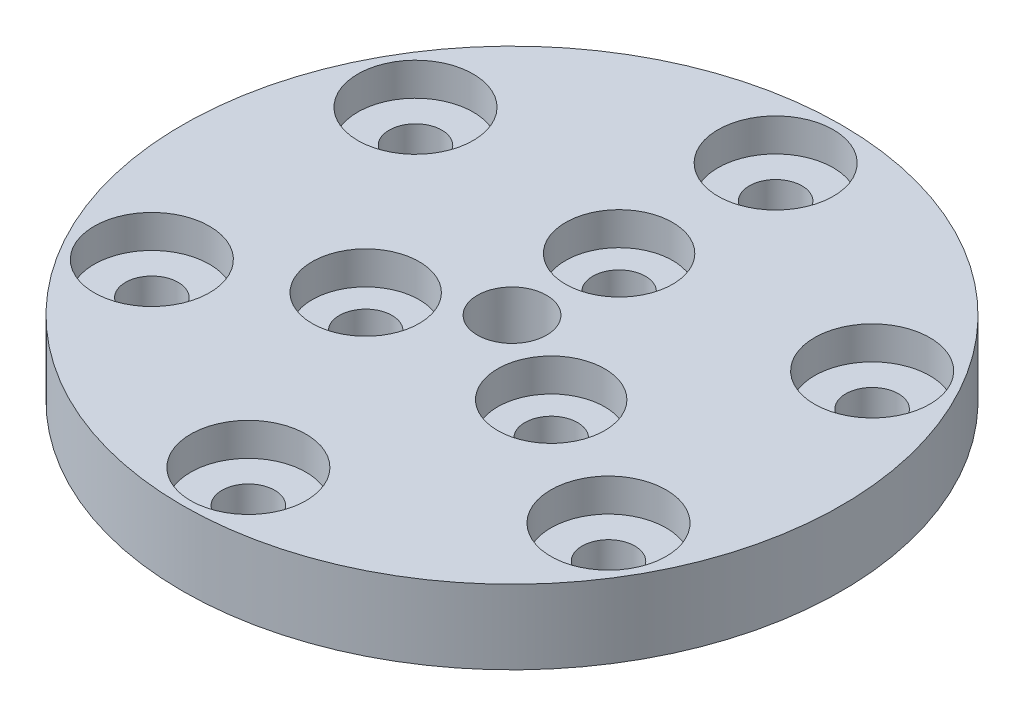
ISO-10303-21;
HEADER;
FILE_DESCRIPTION(('STEP AP214'),'2;1');
FILE_NAME('part.step','',(''),(''),'','','');
FILE_SCHEMA(('AUTOMOTIVE_DESIGN { 1 0 10303 214 1 1 1 1 }'));
ENDSEC;
DATA;
#1=APPLICATION_CONTEXT('core data for automotive mechanical design processes');
#2=APPLICATION_PROTOCOL_DEFINITION('international standard','automotive_design',2000,#1);
#3=PRODUCT_CONTEXT('',#1,'mechanical');
#4=PRODUCT('Part','Part','',(#3));
#5=PRODUCT_RELATED_PRODUCT_CATEGORY('part','',(#4));
#6=PRODUCT_DEFINITION_FORMATION('','',#4);
#7=PRODUCT_DEFINITION_CONTEXT('part definition',#1,'design');
#8=PRODUCT_DEFINITION('design','',#6,#7);
#9=PRODUCT_DEFINITION_SHAPE('','',#8);
#10=(LENGTH_UNIT() NAMED_UNIT(*) SI_UNIT(.MILLI.,.METRE.));
#11=(NAMED_UNIT(*) PLANE_ANGLE_UNIT() SI_UNIT($,.RADIAN.));
#12=(NAMED_UNIT(*) SI_UNIT($,.STERADIAN.) SOLID_ANGLE_UNIT());
#13=UNCERTAINTY_MEASURE_WITH_UNIT(LENGTH_MEASURE(1.E-05),#10,'distance_accuracy_value','');
#14=(GEOMETRIC_REPRESENTATION_CONTEXT(3) GLOBAL_UNCERTAINTY_ASSIGNED_CONTEXT((#13)) GLOBAL_UNIT_ASSIGNED_CONTEXT((#10,
#11,#12)) REPRESENTATION_CONTEXT('',''));
#15=CARTESIAN_POINT('',(0.,0.,0.));
#16=DIRECTION('',(0.,0.,1.));
#17=DIRECTION('',(1.,0.,0.));
#18=AXIS2_PLACEMENT_3D('',#15,#16,#17);
#19=CARTESIAN_POINT('',(-5.6291651245989,0.,3.24999999999996));
#20=DIRECTION('',(0.,1.,0.));
#21=DIRECTION('',(-1.,0.,0.));
#22=AXIS2_PLACEMENT_3D('',#19,#20,#21);
#23=CYLINDRICAL_SURFACE('',#22,1.6);
#24=CARTESIAN_POINT('',(-5.6291651245989,0.,3.24999999999996));
#25=DIRECTION('',(0.,1.,0.));
#26=DIRECTION('',(0.866025403784443,0.,-0.499999999999992));
#27=AXIS2_PLACEMENT_3D('',#24,#25,#26);
#28=CIRCLE('',#27,1.6);
#29=CARTESIAN_POINT('',(-4.24352447854379,0.,2.44999999999997));
#30=VERTEX_POINT('',#29);
#31=EDGE_CURVE('E85',#30,#30,#28,.T.);
#32=ORIENTED_EDGE('',*,*,#31,.F.);
#33=EDGE_LOOP('',(#32));
#34=FACE_BOUND('',#33,.T.);
#35=CARTESIAN_POINT('',(-5.6291651245989,2.50000000000155,3.24999999999996));
#36=DIRECTION('',(0.,1.,0.));
#37=DIRECTION('',(-1.,0.,0.));
#38=AXIS2_PLACEMENT_3D('',#35,#36,#37);
#39=CIRCLE('',#38,1.6);
#40=CARTESIAN_POINT('',(-7.2291651245989,2.50000000000155,3.24999999999996));
#41=VERTEX_POINT('',#40);
#42=EDGE_CURVE('E39',#41,#41,#39,.F.);
#43=ORIENTED_EDGE('',*,*,#42,.F.);
#44=EDGE_LOOP('',(#43));
#45=FACE_BOUND('',#44,.T.);
#46=ADVANCED_FACE('F35',(#34,#45),#23,.F.);
#47=CARTESIAN_POINT('',(5.62916512459886,0.,3.25000000000004));
#48=DIRECTION('',(0.,1.,0.));
#49=DIRECTION('',(-1.,0.,0.));
#50=AXIS2_PLACEMENT_3D('',#47,#48,#49);
#51=CYLINDRICAL_SURFACE('',#50,1.6);
#52=CARTESIAN_POINT('',(5.62916512459886,0.,3.25000000000004));
#53=DIRECTION('',(0.,1.,0.));
#54=DIRECTION('',(-0.866025403784436,0.,-0.500000000000004));
#55=AXIS2_PLACEMENT_3D('',#52,#53,#54);
#56=CIRCLE('',#55,1.6);
#57=CARTESIAN_POINT('',(4.24352447854376,0.,2.45000000000003));
#58=VERTEX_POINT('',#57);
#59=EDGE_CURVE('E100',#58,#58,#56,.T.);
#60=ORIENTED_EDGE('',*,*,#59,.F.);
#61=EDGE_LOOP('',(#60));
#62=FACE_BOUND('',#61,.T.);
#63=CARTESIAN_POINT('',(5.62916512459886,2.50000000000155,3.25000000000004));
#64=DIRECTION('',(0.,1.,0.));
#65=DIRECTION('',(-1.,0.,0.));
#66=AXIS2_PLACEMENT_3D('',#63,#64,#65);
#67=CIRCLE('',#66,1.6);
#68=CARTESIAN_POINT('',(4.02916512459886,2.50000000000155,3.25000000000004));
#69=VERTEX_POINT('',#68);
#70=EDGE_CURVE('E79',#69,#69,#67,.F.);
#71=ORIENTED_EDGE('',*,*,#70,.F.);
#72=EDGE_LOOP('',(#71));
#73=FACE_BOUND('',#72,.T.);
#74=ADVANCED_FACE('F186',(#62,#73),#51,.F.);
#75=CARTESIAN_POINT('',(0.,0.,-6.50000000000002));
#76=DIRECTION('',(0.,1.,0.));
#77=DIRECTION('',(0.,0.,1.));
#78=AXIS2_PLACEMENT_3D('',#75,#76,#77);
#79=CYLINDRICAL_SURFACE('',#78,1.6);
#80=CARTESIAN_POINT('',(0.,0.,-6.50000000000002));
#81=DIRECTION('',(0.,1.,0.));
#82=DIRECTION('',(0.,0.,1.));
#83=AXIS2_PLACEMENT_3D('',#80,#81,#82);
#84=CIRCLE('',#83,1.6);
#85=CARTESIAN_POINT('',(0.,0.,-4.90000000000002));
#86=VERTEX_POINT('',#85);
#87=EDGE_CURVE('E77',#86,#86,#84,.T.);
#88=ORIENTED_EDGE('',*,*,#87,.F.);
#89=EDGE_LOOP('',(#88));
#90=FACE_BOUND('',#89,.T.);
#91=CARTESIAN_POINT('',(0.,2.50000000000155,-6.50000000000002));
#92=DIRECTION('',(0.,1.,0.));
#93=DIRECTION('',(0.,0.,1.));
#94=AXIS2_PLACEMENT_3D('',#91,#92,#93);
#95=CIRCLE('',#94,1.6);
#96=CARTESIAN_POINT('',(0.,2.50000000000155,-4.90000000000002));
#97=VERTEX_POINT('',#96);
#98=EDGE_CURVE('E75',#97,#97,#95,.F.);
#99=ORIENTED_EDGE('',*,*,#98,.F.);
#100=EDGE_LOOP('',(#99));
#101=FACE_BOUND('',#100,.T.);
#102=ADVANCED_FACE('F192',(#90,#101),#79,.F.);
#103=CARTESIAN_POINT('',(-13.856406460551,4.50000000000154,7.99999999999997));
#104=DIRECTION('',(0.,-1.,0.));
#105=DIRECTION('',(0.,0.,-1.));
#106=AXIS2_PLACEMENT_3D('',#103,#104,#105);
#107=CYLINDRICAL_SURFACE('',#106,1.6);
#108=CARTESIAN_POINT('',(-13.856406460551,0.,7.99999999999997));
#109=DIRECTION('',(0.,-1.,0.));
#110=DIRECTION('',(0.86602540378444,0.,-0.499999999999998));
#111=AXIS2_PLACEMENT_3D('',#108,#109,#110);
#112=CIRCLE('',#111,1.6);
#113=CARTESIAN_POINT('',(-12.4707658144959,0.,7.19999999999997));
#114=VERTEX_POINT('',#113);
#115=EDGE_CURVE('E144',#114,#114,#112,.T.);
#116=ORIENTED_EDGE('',*,*,#115,.T.);
#117=EDGE_LOOP('',(#116));
#118=FACE_BOUND('',#117,.T.);
#119=CARTESIAN_POINT('',(-13.856406460551,2.50000000000153,7.99999999999997));
#120=DIRECTION('',(0.,1.,0.));
#121=DIRECTION('',(-1.,0.,0.));
#122=AXIS2_PLACEMENT_3D('',#119,#120,#121);
#123=CIRCLE('',#122,1.6);
#124=CARTESIAN_POINT('',(-15.456406460551,2.50000000000153,7.99999999999997));
#125=VERTEX_POINT('',#124);
#126=EDGE_CURVE('E71',#125,#125,#123,.F.);
#127=ORIENTED_EDGE('',*,*,#126,.F.);
#128=EDGE_LOOP('',(#127));
#129=FACE_BOUND('',#128,.T.);
#130=ADVANCED_FACE('F211',(#118,#129),#107,.F.);
#131=CARTESIAN_POINT('',(-13.856406460551,4.50000000000154,-8.00000000000007));
#132=DIRECTION('',(0.,-1.,0.));
#133=DIRECTION('',(0.,0.,-1.));
#134=AXIS2_PLACEMENT_3D('',#131,#132,#133);
#135=CYLINDRICAL_SURFACE('',#134,1.6);
#136=CARTESIAN_POINT('',(-13.856406460551,0.,-8.00000000000007));
#137=DIRECTION('',(0.,-1.,0.));
#138=DIRECTION('',(0.866025403784436,0.,0.500000000000004));
#139=AXIS2_PLACEMENT_3D('',#136,#137,#138);
#140=CIRCLE('',#139,1.6);
#141=CARTESIAN_POINT('',(-12.4707658144959,0.,-7.20000000000006));
#142=VERTEX_POINT('',#141);
#143=EDGE_CURVE('E141',#142,#142,#140,.T.);
#144=ORIENTED_EDGE('',*,*,#143,.T.);
#145=EDGE_LOOP('',(#144));
#146=FACE_BOUND('',#145,.T.);
#147=CARTESIAN_POINT('',(-13.856406460551,2.50000000000153,-8.00000000000007));
#148=DIRECTION('',(0.,1.,0.));
#149=DIRECTION('',(-1.,0.,0.));
#150=AXIS2_PLACEMENT_3D('',#147,#148,#149);
#151=CIRCLE('',#150,1.6);
#152=CARTESIAN_POINT('',(-15.456406460551,2.50000000000153,-8.00000000000007));
#153=VERTEX_POINT('',#152);
#154=EDGE_CURVE('E68',#153,#153,#151,.F.);
#155=ORIENTED_EDGE('',*,*,#154,.F.);
#156=EDGE_LOOP('',(#155));
#157=FACE_BOUND('',#156,.T.);
#158=ADVANCED_FACE('F252',(#146,#157),#135,.F.);
#159=CARTESIAN_POINT('',(0.,4.50000000000154,-16.));
#160=DIRECTION('',(0.,-1.,0.));
#161=DIRECTION('',(0.,0.,-1.));
#162=AXIS2_PLACEMENT_3D('',#159,#160,#161);
#163=CYLINDRICAL_SURFACE('',#162,1.6);
#164=CARTESIAN_POINT('',(0.,0.,-16.));
#165=DIRECTION('',(0.,-1.,0.));
#166=DIRECTION('',(0.,0.,1.));
#167=AXIS2_PLACEMENT_3D('',#164,#165,#166);
#168=CIRCLE('',#167,1.6);
#169=CARTESIAN_POINT('',(0.,0.,-14.4));
#170=VERTEX_POINT('',#169);
#171=EDGE_CURVE('E145',#170,#170,#168,.T.);
#172=ORIENTED_EDGE('',*,*,#171,.T.);
#173=EDGE_LOOP('',(#172));
#174=FACE_BOUND('',#173,.T.);
#175=CARTESIAN_POINT('',(0.,2.50000000000153,-16.));
#176=DIRECTION('',(0.,1.,0.));
#177=DIRECTION('',(0.,0.,1.));
#178=AXIS2_PLACEMENT_3D('',#175,#176,#177);
#179=CIRCLE('',#178,1.6);
#180=CARTESIAN_POINT('',(0.,2.50000000000153,-14.4));
#181=VERTEX_POINT('',#180);
#182=EDGE_CURVE('E65',#181,#181,#179,.F.);
#183=ORIENTED_EDGE('',*,*,#182,.F.);
#184=EDGE_LOOP('',(#183));
#185=FACE_BOUND('',#184,.T.);
#186=ADVANCED_FACE('F255',(#174,#185),#163,.F.);
#187=CARTESIAN_POINT('',(13.8564064605511,4.50000000000154,-7.99999999999987));
#188=DIRECTION('',(0.,-1.,0.));
#189=DIRECTION('',(0.,0.,-1.));
#190=AXIS2_PLACEMENT_3D('',#187,#188,#189);
#191=CYLINDRICAL_SURFACE('',#190,1.6);
#192=CARTESIAN_POINT('',(13.8564064605511,0.,-7.99999999999987));
#193=DIRECTION('',(0.,-1.,0.));
#194=DIRECTION('',(-0.866025403784443,0.,0.499999999999992));
#195=AXIS2_PLACEMENT_3D('',#192,#193,#194);
#196=CIRCLE('',#195,1.6);
#197=CARTESIAN_POINT('',(12.470765814496,0.,-7.19999999999988));
#198=VERTEX_POINT('',#197);
#199=EDGE_CURVE('E148',#198,#198,#196,.T.);
#200=ORIENTED_EDGE('',*,*,#199,.T.);
#201=EDGE_LOOP('',(#200));
#202=FACE_BOUND('',#201,.T.);
#203=CARTESIAN_POINT('',(13.8564064605511,2.50000000000153,-7.99999999999987));
#204=DIRECTION('',(0.,1.,0.));
#205=DIRECTION('',(-1.,0.,0.));
#206=AXIS2_PLACEMENT_3D('',#203,#204,#205);
#207=CIRCLE('',#206,1.6);
#208=CARTESIAN_POINT('',(12.2564064605511,2.50000000000153,-7.99999999999987));
#209=VERTEX_POINT('',#208);
#210=EDGE_CURVE('E61',#209,#209,#207,.F.);
#211=ORIENTED_EDGE('',*,*,#210,.F.);
#212=EDGE_LOOP('',(#211));
#213=FACE_BOUND('',#212,.T.);
#214=ADVANCED_FACE('F259',(#202,#213),#191,.F.);
#215=CARTESIAN_POINT('',(13.8564064605509,4.50000000000154,8.00000000000016));
#216=DIRECTION('',(0.,-1.,0.));
#217=DIRECTION('',(0.,0.,-1.));
#218=AXIS2_PLACEMENT_3D('',#215,#216,#217);
#219=CYLINDRICAL_SURFACE('',#218,1.6);
#220=CARTESIAN_POINT('',(13.8564064605509,0.,8.00000000000016));
#221=DIRECTION('',(0.,-1.,0.));
#222=DIRECTION('',(-0.866025403784433,0.,-0.50000000000001));
#223=AXIS2_PLACEMENT_3D('',#220,#221,#222);
#224=CIRCLE('',#223,1.6);
#225=CARTESIAN_POINT('',(12.4707658144958,0.,7.20000000000015));
#226=VERTEX_POINT('',#225);
#227=EDGE_CURVE('E74',#226,#226,#224,.T.);
#228=ORIENTED_EDGE('',*,*,#227,.T.);
#229=EDGE_LOOP('',(#228));
#230=FACE_BOUND('',#229,.T.);
#231=CARTESIAN_POINT('',(13.8564064605509,2.50000000000153,8.00000000000016));
#232=DIRECTION('',(0.,1.,0.));
#233=DIRECTION('',(-1.,0.,0.));
#234=AXIS2_PLACEMENT_3D('',#231,#232,#233);
#235=CIRCLE('',#234,1.6);
#236=CARTESIAN_POINT('',(12.2564064605509,2.50000000000153,8.00000000000016));
#237=VERTEX_POINT('',#236);
#238=EDGE_CURVE('E58',#237,#237,#235,.F.);
#239=ORIENTED_EDGE('',*,*,#238,.F.);
#240=EDGE_LOOP('',(#239));
#241=FACE_BOUND('',#240,.T.);
#242=ADVANCED_FACE('F263',(#230,#241),#219,.F.);
#243=CARTESIAN_POINT('',(0.,4.50000000000154,16.));
#244=DIRECTION('',(0.,-1.,0.));
#245=DIRECTION('',(0.,0.,-1.));
#246=AXIS2_PLACEMENT_3D('',#243,#244,#245);
#247=CYLINDRICAL_SURFACE('',#246,1.6);
#248=CARTESIAN_POINT('',(0.,0.,16.));
#249=DIRECTION('',(0.,-1.,0.));
#250=DIRECTION('',(0.,0.,-1.));
#251=AXIS2_PLACEMENT_3D('',#248,#249,#250);
#252=CIRCLE('',#251,1.6);
#253=CARTESIAN_POINT('',(0.,0.,14.4));
#254=VERTEX_POINT('',#253);
#255=EDGE_CURVE('E56',#254,#254,#252,.T.);
#256=ORIENTED_EDGE('',*,*,#255,.T.);
#257=EDGE_LOOP('',(#256));
#258=FACE_BOUND('',#257,.T.);
#259=CARTESIAN_POINT('',(0.,2.50000000000153,16.));
#260=DIRECTION('',(0.,1.,0.));
#261=DIRECTION('',(0.,0.,1.));
#262=AXIS2_PLACEMENT_3D('',#259,#260,#261);
#263=CIRCLE('',#262,1.6);
#264=CARTESIAN_POINT('',(0.,2.50000000000153,17.6));
#265=VERTEX_POINT('',#264);
#266=EDGE_CURVE('E53',#265,#265,#263,.F.);
#267=ORIENTED_EDGE('',*,*,#266,.F.);
#268=EDGE_LOOP('',(#267));
#269=FACE_BOUND('',#268,.T.);
#270=ADVANCED_FACE('F267',(#258,#269),#247,.F.);
#271=CARTESIAN_POINT('',(0.,0.,0.));
#272=DIRECTION('',(0.,1.,0.));
#273=DIRECTION('',(0.,0.,1.));
#274=AXIS2_PLACEMENT_3D('',#271,#272,#273);
#275=PLANE('',#274);
#276=ORIENTED_EDGE('',*,*,#59,.T.);
#277=EDGE_LOOP('',(#276));
#278=FACE_BOUND('',#277,.T.);
#279=ORIENTED_EDGE('',*,*,#31,.T.);
#280=EDGE_LOOP('',(#279));
#281=FACE_BOUND('',#280,.T.);
#282=ORIENTED_EDGE('',*,*,#87,.T.);
#283=EDGE_LOOP('',(#282));
#284=FACE_BOUND('',#283,.T.);
#285=ORIENTED_EDGE('',*,*,#227,.F.);
#286=EDGE_LOOP('',(#285));
#287=FACE_BOUND('',#286,.T.);
#288=ORIENTED_EDGE('',*,*,#199,.F.);
#289=EDGE_LOOP('',(#288));
#290=FACE_BOUND('',#289,.T.);
#291=ORIENTED_EDGE('',*,*,#171,.F.);
#292=EDGE_LOOP('',(#291));
#293=FACE_BOUND('',#292,.T.);
#294=ORIENTED_EDGE('',*,*,#143,.F.);
#295=EDGE_LOOP('',(#294));
#296=FACE_BOUND('',#295,.T.);
#297=ORIENTED_EDGE('',*,*,#115,.F.);
#298=EDGE_LOOP('',(#297));
#299=FACE_BOUND('',#298,.T.);
#300=ORIENTED_EDGE('',*,*,#255,.F.);
#301=EDGE_LOOP('',(#300));
#302=FACE_BOUND('',#301,.T.);
#303=CARTESIAN_POINT('',(0.,0.,0.));
#304=DIRECTION('',(0.,1.,0.));
#305=DIRECTION('',(0.,0.,1.));
#306=AXIS2_PLACEMENT_3D('',#303,#304,#305);
#307=CIRCLE('',#306,20.);
#308=CARTESIAN_POINT('',(0.,0.,20.));
#309=VERTEX_POINT('',#308);
#310=EDGE_CURVE('E43',#309,#309,#307,.T.);
#311=ORIENTED_EDGE('',*,*,#310,.F.);
#312=EDGE_LOOP('',(#311));
#313=FACE_BOUND('',#312,.T.);
#314=CARTESIAN_POINT('',(0.,0.,0.));
#315=DIRECTION('',(0.,1.,0.));
#316=DIRECTION('',(0.,0.,1.));
#317=AXIS2_PLACEMENT_3D('',#314,#315,#316);
#318=CIRCLE('',#317,2.1);
#319=CARTESIAN_POINT('',(0.,0.,2.1));
#320=VERTEX_POINT('',#319);
#321=EDGE_CURVE('E161',#320,#320,#318,.T.);
#322=ORIENTED_EDGE('',*,*,#321,.T.);
#323=EDGE_LOOP('',(#322));
#324=FACE_BOUND('',#323,.T.);
#325=ADVANCED_FACE('F277',(#278,#281,#284,#287,#290,#293,#296,#299,#302,#313,#324),#275,.F.);
#326=CARTESIAN_POINT('',(0.,61.0685424949254,0.));
#327=DIRECTION('',(0.,-1.,0.));
#328=DIRECTION('',(0.,0.,-1.));
#329=AXIS2_PLACEMENT_3D('',#326,#327,#328);
#330=CYLINDRICAL_SURFACE('',#329,20.);
#331=CARTESIAN_POINT('',(0.,4.50000000000154,0.));
#332=DIRECTION('',(0.,-1.,0.));
#333=DIRECTION('',(0.,0.,-1.));
#334=AXIS2_PLACEMENT_3D('',#331,#332,#333);
#335=CIRCLE('',#334,20.);
#336=CARTESIAN_POINT('',(0.,4.50000000000154,-20.));
#337=VERTEX_POINT('',#336);
#338=EDGE_CURVE('E48',#337,#337,#335,.T.);
#339=ORIENTED_EDGE('',*,*,#338,.T.);
#340=EDGE_LOOP('',(#339));
#341=FACE_BOUND('',#340,.T.);
#342=ORIENTED_EDGE('',*,*,#310,.T.);
#343=EDGE_LOOP('',(#342));
#344=FACE_BOUND('',#343,.T.);
#345=ADVANCED_FACE('F168',(#341,#344),#330,.T.);
#346=CARTESIAN_POINT('',(0.,61.0685424949254,0.));
#347=DIRECTION('',(0.,-1.,0.));
#348=DIRECTION('',(0.,0.,-1.));
#349=AXIS2_PLACEMENT_3D('',#346,#347,#348);
#350=CYLINDRICAL_SURFACE('',#349,2.1);
#351=CARTESIAN_POINT('',(0.,4.50000000000154,0.));
#352=DIRECTION('',(0.,-1.,0.));
#353=DIRECTION('',(0.,0.,-1.));
#354=AXIS2_PLACEMENT_3D('',#351,#352,#353);
#355=CIRCLE('',#354,2.1);
#356=CARTESIAN_POINT('',(0.,4.50000000000154,-2.1));
#357=VERTEX_POINT('',#356);
#358=EDGE_CURVE('E10',#357,#357,#355,.T.);
#359=ORIENTED_EDGE('',*,*,#358,.F.);
#360=EDGE_LOOP('',(#359));
#361=FACE_BOUND('',#360,.T.);
#362=ORIENTED_EDGE('',*,*,#321,.F.);
#363=EDGE_LOOP('',(#362));
#364=FACE_BOUND('',#363,.T.);
#365=ADVANCED_FACE('F173',(#361,#364),#350,.F.);
#366=CARTESIAN_POINT('',(-3.7472518908115E-13,4.50000000000155,1.80441954245813E-13));
#367=DIRECTION('',(0.,-1.,0.));
#368=DIRECTION('',(0.824287954122413,0.,-0.566170794627105));
#369=AXIS2_PLACEMENT_3D('',#366,#367,#368);
#370=PLANE('',#369);
#371=CARTESIAN_POINT('',(5.62916512459885,4.50000000000155,3.25000000000004));
#372=DIRECTION('',(0.,1.,0.));
#373=DIRECTION('',(-0.866025403784436,0.,-0.500000000000004));
#374=AXIS2_PLACEMENT_3D('',#371,#372,#373);
#375=CIRCLE('',#374,3.25);
#376=CARTESIAN_POINT('',(2.81458256229944,4.50000000000155,1.62500000000002));
#377=VERTEX_POINT('',#376);
#378=EDGE_CURVE('E87',#377,#377,#375,.T.);
#379=ORIENTED_EDGE('',*,*,#378,.F.);
#380=EDGE_LOOP('',(#379));
#381=FACE_BOUND('',#380,.T.);
#382=CARTESIAN_POINT('',(-5.6291651245989,4.50000000000155,3.24999999999996));
#383=DIRECTION('',(0.,1.,0.));
#384=DIRECTION('',(0.866025403784443,0.,-0.499999999999992));
#385=AXIS2_PLACEMENT_3D('',#382,#383,#384);
#386=CIRCLE('',#385,3.25);
#387=CARTESIAN_POINT('',(-2.81458256229946,4.50000000000155,1.62499999999998));
#388=VERTEX_POINT('',#387);
#389=EDGE_CURVE('E97',#388,#388,#386,.T.);
#390=ORIENTED_EDGE('',*,*,#389,.F.);
#391=EDGE_LOOP('',(#390));
#392=FACE_BOUND('',#391,.T.);
#393=CARTESIAN_POINT('',(0.,4.50000000000155,-6.50000000000002));
#394=DIRECTION('',(0.,1.,0.));
#395=DIRECTION('',(0.,0.,1.));
#396=AXIS2_PLACEMENT_3D('',#393,#394,#395);
#397=CIRCLE('',#396,3.25);
#398=CARTESIAN_POINT('',(0.,4.50000000000155,-3.25000000000002));
#399=VERTEX_POINT('',#398);
#400=EDGE_CURVE('E103',#399,#399,#397,.T.);
#401=ORIENTED_EDGE('',*,*,#400,.F.);
#402=EDGE_LOOP('',(#401));
#403=FACE_BOUND('',#402,.T.);
#404=CARTESIAN_POINT('',(13.8564064605509,4.50000000000153,8.00000000000016));
#405=DIRECTION('',(0.,1.,0.));
#406=DIRECTION('',(0.866025403784433,0.,0.50000000000001));
#407=AXIS2_PLACEMENT_3D('',#404,#405,#406);
#408=CIRCLE('',#407,3.5);
#409=CARTESIAN_POINT('',(16.8874953737964,4.50000000000153,9.7500000000002));
#410=VERTEX_POINT('',#409);
#411=EDGE_CURVE('E112',#410,#410,#408,.T.);
#412=ORIENTED_EDGE('',*,*,#411,.F.);
#413=EDGE_LOOP('',(#412));
#414=FACE_BOUND('',#413,.T.);
#415=CARTESIAN_POINT('',(13.8564064605511,4.50000000000153,-7.99999999999987));
#416=DIRECTION('',(0.,1.,0.));
#417=DIRECTION('',(0.866025403784443,0.,-0.499999999999992));
#418=AXIS2_PLACEMENT_3D('',#415,#416,#417);
#419=CIRCLE('',#418,3.5);
#420=CARTESIAN_POINT('',(16.8874953737967,4.50000000000153,-9.74999999999985));
#421=VERTEX_POINT('',#420);
#422=EDGE_CURVE('E129',#421,#421,#419,.T.);
#423=ORIENTED_EDGE('',*,*,#422,.F.);
#424=EDGE_LOOP('',(#423));
#425=FACE_BOUND('',#424,.T.);
#426=CARTESIAN_POINT('',(0.,4.50000000000153,-16.));
#427=DIRECTION('',(0.,1.,0.));
#428=DIRECTION('',(0.,0.,-1.));
#429=AXIS2_PLACEMENT_3D('',#426,#427,#428);
#430=CIRCLE('',#429,3.5);
#431=CARTESIAN_POINT('',(0.,4.50000000000153,-19.5));
#432=VERTEX_POINT('',#431);
#433=EDGE_CURVE('E123',#432,#432,#430,.T.);
#434=ORIENTED_EDGE('',*,*,#433,.F.);
#435=EDGE_LOOP('',(#434));
#436=FACE_BOUND('',#435,.T.);
#437=CARTESIAN_POINT('',(-13.856406460551,4.50000000000153,-8.00000000000007));
#438=DIRECTION('',(0.,1.,0.));
#439=DIRECTION('',(-0.866025403784436,0.,-0.500000000000004));
#440=AXIS2_PLACEMENT_3D('',#437,#438,#439);
#441=CIRCLE('',#440,3.5);
#442=CARTESIAN_POINT('',(-16.8874953737965,4.50000000000153,-9.75000000000008));
#443=VERTEX_POINT('',#442);
#444=EDGE_CURVE('E117',#443,#443,#441,.T.);
#445=ORIENTED_EDGE('',*,*,#444,.F.);
#446=EDGE_LOOP('',(#445));
#447=FACE_BOUND('',#446,.T.);
#448=CARTESIAN_POINT('',(-13.856406460551,4.50000000000153,7.99999999999997));
#449=DIRECTION('',(0.,1.,0.));
#450=DIRECTION('',(-0.86602540378444,0.,0.499999999999998));
#451=AXIS2_PLACEMENT_3D('',#448,#449,#450);
#452=CIRCLE('',#451,3.5);
#453=CARTESIAN_POINT('',(-16.8874953737966,4.50000000000153,9.74999999999996));
#454=VERTEX_POINT('',#453);
#455=EDGE_CURVE('E116',#454,#454,#452,.T.);
#456=ORIENTED_EDGE('',*,*,#455,.F.);
#457=EDGE_LOOP('',(#456));
#458=FACE_BOUND('',#457,.T.);
#459=CARTESIAN_POINT('',(0.,4.50000000000153,16.));
#460=DIRECTION('',(0.,1.,0.));
#461=DIRECTION('',(0.,0.,1.));
#462=AXIS2_PLACEMENT_3D('',#459,#460,#461);
#463=CIRCLE('',#462,3.5);
#464=CARTESIAN_POINT('',(0.,4.50000000000153,19.5));
#465=VERTEX_POINT('',#464);
#466=EDGE_CURVE('E155',#465,#465,#463,.T.);
#467=ORIENTED_EDGE('',*,*,#466,.F.);
#468=EDGE_LOOP('',(#467));
#469=FACE_BOUND('',#468,.T.);
#470=ORIENTED_EDGE('',*,*,#358,.T.);
#471=EDGE_LOOP('',(#470));
#472=FACE_BOUND('',#471,.T.);
#473=ORIENTED_EDGE('',*,*,#338,.F.);
#474=EDGE_LOOP('',(#473));
#475=FACE_BOUND('',#474,.T.);
#476=ADVANCED_FACE('F37',(#381,#392,#403,#414,#425,#436,#447,#458,#469,#472,#475),#370,.F.);
#477=CARTESIAN_POINT('',(0.,2.50000000000153,16.));
#478=DIRECTION('',(0.,1.,0.));
#479=DIRECTION('',(0.,0.,1.));
#480=AXIS2_PLACEMENT_3D('',#477,#478,#479);
#481=PLANE('',#480);
#482=CARTESIAN_POINT('',(0.,2.50000000000153,16.));
#483=DIRECTION('',(0.,1.,0.));
#484=DIRECTION('',(0.,0.,1.));
#485=AXIS2_PLACEMENT_3D('',#482,#483,#484);
#486=CIRCLE('',#485,3.5);
#487=CARTESIAN_POINT('',(0.,2.50000000000153,19.5));
#488=VERTEX_POINT('',#487);
#489=EDGE_CURVE('E57',#488,#488,#486,.T.);
#490=ORIENTED_EDGE('',*,*,#489,.T.);
#491=EDGE_LOOP('',(#490));
#492=FACE_BOUND('',#491,.T.);
#493=ORIENTED_EDGE('',*,*,#266,.T.);
#494=EDGE_LOOP('',(#493));
#495=FACE_BOUND('',#494,.T.);
#496=ADVANCED_FACE('F172',(#492,#495),#481,.T.);
#497=CARTESIAN_POINT('',(0.,2.50000000000153,16.));
#498=DIRECTION('',(0.,1.,0.));
#499=DIRECTION('',(0.,0.,1.));
#500=AXIS2_PLACEMENT_3D('',#497,#498,#499);
#501=CYLINDRICAL_SURFACE('',#500,3.5);
#502=ORIENTED_EDGE('',*,*,#489,.F.);
#503=EDGE_LOOP('',(#502));
#504=FACE_BOUND('',#503,.T.);
#505=ORIENTED_EDGE('',*,*,#466,.T.);
#506=EDGE_LOOP('',(#505));
#507=FACE_BOUND('',#506,.T.);
#508=ADVANCED_FACE('F179',(#504,#507),#501,.F.);
#509=CARTESIAN_POINT('',(13.8564064605509,2.50000000000153,8.00000000000016));
#510=DIRECTION('',(0.,1.,0.));
#511=DIRECTION('',(0.866025403784433,0.,0.50000000000001));
#512=AXIS2_PLACEMENT_3D('',#509,#510,#511);
#513=PLANE('',#512);
#514=CARTESIAN_POINT('',(13.8564064605509,2.50000000000153,8.00000000000016));
#515=DIRECTION('',(0.,1.,0.));
#516=DIRECTION('',(0.866025403784433,0.,0.50000000000001));
#517=AXIS2_PLACEMENT_3D('',#514,#515,#516);
#518=CIRCLE('',#517,3.5);
#519=CARTESIAN_POINT('',(16.8874953737964,2.50000000000153,9.7500000000002));
#520=VERTEX_POINT('',#519);
#521=EDGE_CURVE('E132',#520,#520,#518,.T.);
#522=ORIENTED_EDGE('',*,*,#521,.T.);
#523=EDGE_LOOP('',(#522));
#524=FACE_BOUND('',#523,.T.);
#525=ORIENTED_EDGE('',*,*,#238,.T.);
#526=EDGE_LOOP('',(#525));
#527=FACE_BOUND('',#526,.T.);
#528=ADVANCED_FACE('F239',(#524,#527),#513,.T.);
#529=CARTESIAN_POINT('',(13.8564064605509,2.50000000000153,8.00000000000016));
#530=DIRECTION('',(0.,1.,0.));
#531=DIRECTION('',(-1.,0.,0.));
#532=AXIS2_PLACEMENT_3D('',#529,#530,#531);
#533=CYLINDRICAL_SURFACE('',#532,3.5);
#534=ORIENTED_EDGE('',*,*,#521,.F.);
#535=EDGE_LOOP('',(#534));
#536=FACE_BOUND('',#535,.T.);
#537=ORIENTED_EDGE('',*,*,#411,.T.);
#538=EDGE_LOOP('',(#537));
#539=FACE_BOUND('',#538,.T.);
#540=ADVANCED_FACE('F234',(#536,#539),#533,.F.);
#541=CARTESIAN_POINT('',(13.8564064605511,2.50000000000153,-7.99999999999987));
#542=DIRECTION('',(0.,1.,0.));
#543=DIRECTION('',(0.866025403784443,0.,-0.499999999999992));
#544=AXIS2_PLACEMENT_3D('',#541,#542,#543);
#545=PLANE('',#544);
#546=CARTESIAN_POINT('',(13.8564064605511,2.50000000000153,-7.99999999999987));
#547=DIRECTION('',(0.,1.,0.));
#548=DIRECTION('',(0.866025403784443,0.,-0.499999999999992));
#549=AXIS2_PLACEMENT_3D('',#546,#547,#548);
#550=CIRCLE('',#549,3.5);
#551=CARTESIAN_POINT('',(16.8874953737966,2.50000000000153,-9.74999999999984));
#552=VERTEX_POINT('',#551);
#553=EDGE_CURVE('E126',#552,#552,#550,.T.);
#554=ORIENTED_EDGE('',*,*,#553,.T.);
#555=EDGE_LOOP('',(#554));
#556=FACE_BOUND('',#555,.T.);
#557=ORIENTED_EDGE('',*,*,#210,.T.);
#558=EDGE_LOOP('',(#557));
#559=FACE_BOUND('',#558,.T.);
#560=ADVANCED_FACE('F231',(#556,#559),#545,.T.);
#561=CARTESIAN_POINT('',(13.8564064605511,2.50000000000153,-7.99999999999987));
#562=DIRECTION('',(0.,1.,0.));
#563=DIRECTION('',(-1.,0.,0.));
#564=AXIS2_PLACEMENT_3D('',#561,#562,#563);
#565=CYLINDRICAL_SURFACE('',#564,3.5);
#566=ORIENTED_EDGE('',*,*,#553,.F.);
#567=EDGE_LOOP('',(#566));
#568=FACE_BOUND('',#567,.T.);
#569=ORIENTED_EDGE('',*,*,#422,.T.);
#570=EDGE_LOOP('',(#569));
#571=FACE_BOUND('',#570,.T.);
#572=ADVANCED_FACE('F226',(#568,#571),#565,.F.);
#573=CARTESIAN_POINT('',(0.,2.50000000000153,-16.));
#574=DIRECTION('',(0.,1.,0.));
#575=DIRECTION('',(0.,0.,-1.));
#576=AXIS2_PLACEMENT_3D('',#573,#574,#575);
#577=PLANE('',#576);
#578=CARTESIAN_POINT('',(0.,2.50000000000153,-16.));
#579=DIRECTION('',(0.,1.,0.));
#580=DIRECTION('',(0.,0.,-1.));
#581=AXIS2_PLACEMENT_3D('',#578,#579,#580);
#582=CIRCLE('',#581,3.5);
#583=CARTESIAN_POINT('',(0.,2.50000000000153,-19.5));
#584=VERTEX_POINT('',#583);
#585=EDGE_CURVE('E120',#584,#584,#582,.T.);
#586=ORIENTED_EDGE('',*,*,#585,.T.);
#587=EDGE_LOOP('',(#586));
#588=FACE_BOUND('',#587,.T.);
#589=ORIENTED_EDGE('',*,*,#182,.T.);
#590=EDGE_LOOP('',(#589));
#591=FACE_BOUND('',#590,.T.);
#592=ADVANCED_FACE('F223',(#588,#591),#577,.T.);
#593=CARTESIAN_POINT('',(0.,2.50000000000153,-16.));
#594=DIRECTION('',(0.,1.,0.));
#595=DIRECTION('',(0.,0.,1.));
#596=AXIS2_PLACEMENT_3D('',#593,#594,#595);
#597=CYLINDRICAL_SURFACE('',#596,3.5);
#598=ORIENTED_EDGE('',*,*,#585,.F.);
#599=EDGE_LOOP('',(#598));
#600=FACE_BOUND('',#599,.T.);
#601=ORIENTED_EDGE('',*,*,#433,.T.);
#602=EDGE_LOOP('',(#601));
#603=FACE_BOUND('',#602,.T.);
#604=ADVANCED_FACE('F217',(#600,#603),#597,.F.);
#605=CARTESIAN_POINT('',(-13.856406460551,2.50000000000153,-8.00000000000007));
#606=DIRECTION('',(0.,1.,0.));
#607=DIRECTION('',(-0.866025403784436,0.,-0.500000000000004));
#608=AXIS2_PLACEMENT_3D('',#605,#606,#607);
#609=PLANE('',#608);
#610=CARTESIAN_POINT('',(-13.856406460551,2.50000000000153,-8.00000000000007));
#611=DIRECTION('',(0.,1.,0.));
#612=DIRECTION('',(-0.866025403784436,0.,-0.500000000000004));
#613=AXIS2_PLACEMENT_3D('',#610,#611,#612);
#614=CIRCLE('',#613,3.5);
#615=CARTESIAN_POINT('',(-16.8874953737965,2.50000000000153,-9.75000000000008));
#616=VERTEX_POINT('',#615);
#617=EDGE_CURVE('E113',#616,#616,#614,.T.);
#618=ORIENTED_EDGE('',*,*,#617,.T.);
#619=EDGE_LOOP('',(#618));
#620=FACE_BOUND('',#619,.T.);
#621=ORIENTED_EDGE('',*,*,#154,.T.);
#622=EDGE_LOOP('',(#621));
#623=FACE_BOUND('',#622,.T.);
#624=ADVANCED_FACE('F213',(#620,#623),#609,.T.);
#625=CARTESIAN_POINT('',(-13.856406460551,2.50000000000153,-8.00000000000007));
#626=DIRECTION('',(0.,1.,0.));
#627=DIRECTION('',(-1.,0.,0.));
#628=AXIS2_PLACEMENT_3D('',#625,#626,#627);
#629=CYLINDRICAL_SURFACE('',#628,3.5);
#630=ORIENTED_EDGE('',*,*,#617,.F.);
#631=EDGE_LOOP('',(#630));
#632=FACE_BOUND('',#631,.T.);
#633=ORIENTED_EDGE('',*,*,#444,.T.);
#634=EDGE_LOOP('',(#633));
#635=FACE_BOUND('',#634,.T.);
#636=ADVANCED_FACE('F216',(#632,#635),#629,.F.);
#637=CARTESIAN_POINT('',(-13.856406460551,2.50000000000153,7.99999999999997));
#638=DIRECTION('',(0.,1.,0.));
#639=DIRECTION('',(-0.86602540378444,0.,0.499999999999998));
#640=AXIS2_PLACEMENT_3D('',#637,#638,#639);
#641=PLANE('',#640);
#642=CARTESIAN_POINT('',(-13.856406460551,2.50000000000153,7.99999999999997));
#643=DIRECTION('',(0.,1.,0.));
#644=DIRECTION('',(-0.86602540378444,0.,0.499999999999998));
#645=AXIS2_PLACEMENT_3D('',#642,#643,#644);
#646=CIRCLE('',#645,3.5);
#647=CARTESIAN_POINT('',(-16.8874953737966,2.50000000000153,9.74999999999996));
#648=VERTEX_POINT('',#647);
#649=EDGE_CURVE('E62',#648,#648,#646,.T.);
#650=ORIENTED_EDGE('',*,*,#649,.T.);
#651=EDGE_LOOP('',(#650));
#652=FACE_BOUND('',#651,.T.);
#653=ORIENTED_EDGE('',*,*,#126,.T.);
#654=EDGE_LOOP('',(#653));
#655=FACE_BOUND('',#654,.T.);
#656=ADVANCED_FACE('F221',(#652,#655),#641,.T.);
#657=CARTESIAN_POINT('',(-13.856406460551,2.50000000000153,7.99999999999997));
#658=DIRECTION('',(0.,1.,0.));
#659=DIRECTION('',(-1.,0.,0.));
#660=AXIS2_PLACEMENT_3D('',#657,#658,#659);
#661=CYLINDRICAL_SURFACE('',#660,3.5);
#662=ORIENTED_EDGE('',*,*,#649,.F.);
#663=EDGE_LOOP('',(#662));
#664=FACE_BOUND('',#663,.T.);
#665=ORIENTED_EDGE('',*,*,#455,.T.);
#666=EDGE_LOOP('',(#665));
#667=FACE_BOUND('',#666,.T.);
#668=ADVANCED_FACE('F203',(#664,#667),#661,.F.);
#669=CARTESIAN_POINT('',(0.,2.50000000000155,-6.50000000000002));
#670=DIRECTION('',(0.,1.,0.));
#671=DIRECTION('',(0.,0.,1.));
#672=AXIS2_PLACEMENT_3D('',#669,#670,#671);
#673=PLANE('',#672);
#674=CARTESIAN_POINT('',(0.,2.50000000000155,-6.50000000000002));
#675=DIRECTION('',(0.,1.,0.));
#676=DIRECTION('',(0.,0.,1.));
#677=AXIS2_PLACEMENT_3D('',#674,#675,#676);
#678=CIRCLE('',#677,3.25);
#679=CARTESIAN_POINT('',(0.,2.50000000000155,-3.25000000000002));
#680=VERTEX_POINT('',#679);
#681=EDGE_CURVE('E78',#680,#680,#678,.T.);
#682=ORIENTED_EDGE('',*,*,#681,.T.);
#683=EDGE_LOOP('',(#682));
#684=FACE_BOUND('',#683,.T.);
#685=ORIENTED_EDGE('',*,*,#98,.T.);
#686=EDGE_LOOP('',(#685));
#687=FACE_BOUND('',#686,.T.);
#688=ADVANCED_FACE('F199',(#684,#687),#673,.T.);
#689=CARTESIAN_POINT('',(0.,2.50000000000155,-6.50000000000002));
#690=DIRECTION('',(0.,1.,0.));
#691=DIRECTION('',(0.,0.,1.));
#692=AXIS2_PLACEMENT_3D('',#689,#690,#691);
#693=CYLINDRICAL_SURFACE('',#692,3.25);
#694=ORIENTED_EDGE('',*,*,#681,.F.);
#695=EDGE_LOOP('',(#694));
#696=FACE_BOUND('',#695,.T.);
#697=ORIENTED_EDGE('',*,*,#400,.T.);
#698=EDGE_LOOP('',(#697));
#699=FACE_BOUND('',#698,.T.);
#700=ADVANCED_FACE('F202',(#696,#699),#693,.F.);
#701=CARTESIAN_POINT('',(5.62916512459886,2.50000000000155,3.25000000000004));
#702=DIRECTION('',(0.,1.,0.));
#703=DIRECTION('',(-0.866025403784436,0.,-0.500000000000004));
#704=AXIS2_PLACEMENT_3D('',#701,#702,#703);
#705=PLANE('',#704);
#706=CARTESIAN_POINT('',(5.62916512459886,2.50000000000155,3.25000000000004));
#707=DIRECTION('',(0.,1.,0.));
#708=DIRECTION('',(-0.866025403784436,0.,-0.500000000000004));
#709=AXIS2_PLACEMENT_3D('',#706,#707,#708);
#710=CIRCLE('',#709,3.25);
#711=CARTESIAN_POINT('',(2.81458256229944,2.50000000000155,1.62500000000002));
#712=VERTEX_POINT('',#711);
#713=EDGE_CURVE('E81',#712,#712,#710,.T.);
#714=ORIENTED_EDGE('',*,*,#713,.T.);
#715=EDGE_LOOP('',(#714));
#716=FACE_BOUND('',#715,.T.);
#717=ORIENTED_EDGE('',*,*,#70,.T.);
#718=EDGE_LOOP('',(#717));
#719=FACE_BOUND('',#718,.T.);
#720=ADVANCED_FACE('F207',(#716,#719),#705,.T.);
#721=CARTESIAN_POINT('',(5.62916512459886,2.50000000000155,3.25000000000004));
#722=DIRECTION('',(0.,1.,0.));
#723=DIRECTION('',(-1.,0.,0.));
#724=AXIS2_PLACEMENT_3D('',#721,#722,#723);
#725=CYLINDRICAL_SURFACE('',#724,3.25);
#726=ORIENTED_EDGE('',*,*,#713,.F.);
#727=EDGE_LOOP('',(#726));
#728=FACE_BOUND('',#727,.T.);
#729=ORIENTED_EDGE('',*,*,#378,.T.);
#730=EDGE_LOOP('',(#729));
#731=FACE_BOUND('',#730,.T.);
#732=ADVANCED_FACE('F462',(#728,#731),#725,.F.);
#733=CARTESIAN_POINT('',(-5.6291651245989,2.50000000000155,3.24999999999996));
#734=DIRECTION('',(0.,1.,0.));
#735=DIRECTION('',(0.866025403784443,0.,-0.499999999999992));
#736=AXIS2_PLACEMENT_3D('',#733,#734,#735);
#737=PLANE('',#736);
#738=CARTESIAN_POINT('',(-5.6291651245989,2.50000000000155,3.24999999999996));
#739=DIRECTION('',(0.,1.,0.));
#740=DIRECTION('',(0.866025403784443,0.,-0.499999999999992));
#741=AXIS2_PLACEMENT_3D('',#738,#739,#740);
#742=CIRCLE('',#741,3.25);
#743=CARTESIAN_POINT('',(-2.81458256229946,2.50000000000155,1.62499999999998));
#744=VERTEX_POINT('',#743);
#745=EDGE_CURVE('E92',#744,#744,#742,.T.);
#746=ORIENTED_EDGE('',*,*,#745,.T.);
#747=EDGE_LOOP('',(#746));
#748=FACE_BOUND('',#747,.T.);
#749=ORIENTED_EDGE('',*,*,#42,.T.);
#750=EDGE_LOOP('',(#749));
#751=FACE_BOUND('',#750,.T.);
#752=ADVANCED_FACE('F471',(#748,#751),#737,.T.);
#753=CARTESIAN_POINT('',(-5.6291651245989,2.50000000000155,3.24999999999996));
#754=DIRECTION('',(0.,1.,0.));
#755=DIRECTION('',(-1.,0.,0.));
#756=AXIS2_PLACEMENT_3D('',#753,#754,#755);
#757=CYLINDRICAL_SURFACE('',#756,3.25);
#758=ORIENTED_EDGE('',*,*,#745,.F.);
#759=EDGE_LOOP('',(#758));
#760=FACE_BOUND('',#759,.T.);
#761=ORIENTED_EDGE('',*,*,#389,.T.);
#762=EDGE_LOOP('',(#761));
#763=FACE_BOUND('',#762,.T.);
#764=ADVANCED_FACE('F482',(#760,#763),#757,.F.);
#765=CLOSED_SHELL('',(#46,#74,#102,#130,#158,#186,#214,#242,#270,#325,#345,#365,#476,#496,#508,
#528,#540,#560,#572,#592,#604,#624,#636,#656,#668,#688,#700,#720,#732,#752,#764));
#766=MANIFOLD_SOLID_BREP('B2',#765);
#767=ADVANCED_BREP_SHAPE_REPRESENTATION('',(#18,#766),#14);
#768=SHAPE_DEFINITION_REPRESENTATION(#9,#767);
ENDSEC;
END-ISO-10303-21;
